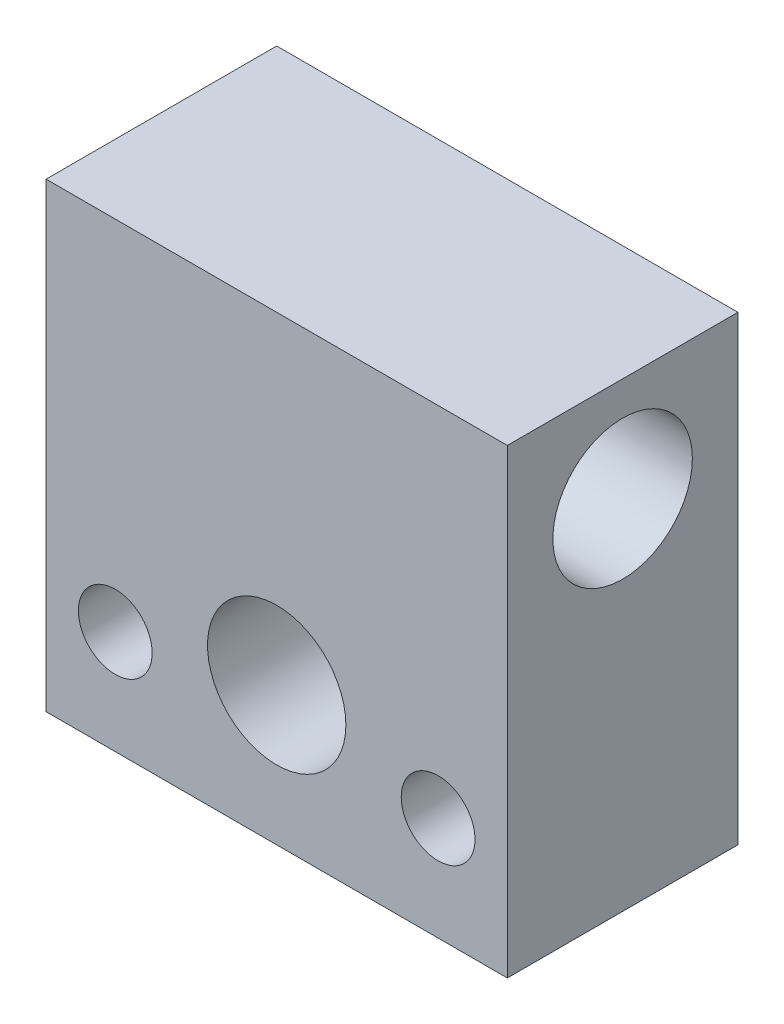
ISO-10303-21;
HEADER;
FILE_DESCRIPTION(('STEP AP214'),'2;1');
FILE_NAME('part.step','',(''),(''),'','','');
FILE_SCHEMA(('AUTOMOTIVE_DESIGN { 1 0 10303 214 1 1 1 1 }'));
ENDSEC;
DATA;
#1=APPLICATION_CONTEXT('core data for automotive mechanical design processes');
#2=APPLICATION_PROTOCOL_DEFINITION('international standard','automotive_design',2000,#1);
#3=PRODUCT_CONTEXT('',#1,'mechanical');
#4=PRODUCT('Part','Part','',(#3));
#5=PRODUCT_RELATED_PRODUCT_CATEGORY('part','',(#4));
#6=PRODUCT_DEFINITION_FORMATION('','',#4);
#7=PRODUCT_DEFINITION_CONTEXT('part definition',#1,'design');
#8=PRODUCT_DEFINITION('design','',#6,#7);
#9=PRODUCT_DEFINITION_SHAPE('','',#8);
#10=(LENGTH_UNIT() NAMED_UNIT(*) SI_UNIT(.MILLI.,.METRE.));
#11=(NAMED_UNIT(*) PLANE_ANGLE_UNIT() SI_UNIT($,.RADIAN.));
#12=(NAMED_UNIT(*) SI_UNIT($,.STERADIAN.) SOLID_ANGLE_UNIT());
#13=UNCERTAINTY_MEASURE_WITH_UNIT(LENGTH_MEASURE(1.E-05),#10,'distance_accuracy_value','');
#14=(GEOMETRIC_REPRESENTATION_CONTEXT(3) GLOBAL_UNCERTAINTY_ASSIGNED_CONTEXT((#13)) GLOBAL_UNIT_ASSIGNED_CONTEXT((#10,
#11,#12)) REPRESENTATION_CONTEXT('',''));
#15=CARTESIAN_POINT('',(0.,0.,0.));
#16=DIRECTION('',(0.,0.,1.));
#17=DIRECTION('',(1.,0.,0.));
#18=AXIS2_PLACEMENT_3D('',#15,#16,#17);
#19=CARTESIAN_POINT('',(10.,10.,10.));
#20=DIRECTION('',(1.,0.,0.));
#21=DIRECTION('',(0.,0.,-1.));
#22=AXIS2_PLACEMENT_3D('',#19,#20,#21);
#23=PLANE('',#22);
#24=CARTESIAN_POINT('',(10.,5.5,5.));
#25=DIRECTION('',(1.,0.,0.));
#26=DIRECTION('',(0.,0.,-1.));
#27=AXIS2_PLACEMENT_3D('',#24,#25,#26);
#28=CIRCLE('',#27,3.02500000000001);
#29=CARTESIAN_POINT('',(10.,5.5,1.97499999999999));
#30=VERTEX_POINT('',#29);
#31=EDGE_CURVE('E214',#30,#30,#28,.T.);
#32=ORIENTED_EDGE('',*,*,#31,.F.);
#33=EDGE_LOOP('',(#32));
#34=FACE_BOUND('',#33,.T.);
#35=DIRECTION('',(0.,-1.,0.));
#36=VECTOR('',#35,1.);
#37=CARTESIAN_POINT('',(10.,10.,0.));
#38=LINE('',#37,#36);
#39=CARTESIAN_POINT('',(10.,10.,0.));
#40=VERTEX_POINT('',#39);
#41=CARTESIAN_POINT('',(10.,-10.,0.));
#42=VERTEX_POINT('',#41);
#43=EDGE_CURVE('E108',#40,#42,#38,.T.);
#44=ORIENTED_EDGE('',*,*,#43,.F.);
#45=DIRECTION('',(0.,0.,-1.));
#46=VECTOR('',#45,1.);
#47=CARTESIAN_POINT('',(10.,10.,10.));
#48=LINE('',#47,#46);
#49=CARTESIAN_POINT('',(10.,10.,10.));
#50=VERTEX_POINT('',#49);
#51=EDGE_CURVE('E56',#50,#40,#48,.T.);
#52=ORIENTED_EDGE('',*,*,#51,.F.);
#53=DIRECTION('',(0.,-1.,0.));
#54=VECTOR('',#53,1.);
#55=CARTESIAN_POINT('',(10.,10.,10.));
#56=LINE('',#55,#54);
#57=CARTESIAN_POINT('',(10.,-10.,10.));
#58=VERTEX_POINT('',#57);
#59=EDGE_CURVE('E101',#50,#58,#56,.T.);
#60=ORIENTED_EDGE('',*,*,#59,.T.);
#61=DIRECTION('',(0.,0.,-1.));
#62=VECTOR('',#61,1.);
#63=CARTESIAN_POINT('',(10.,-10.,10.));
#64=LINE('',#63,#62);
#65=EDGE_CURVE('E84',#58,#42,#64,.T.);
#66=ORIENTED_EDGE('',*,*,#65,.T.);
#67=EDGE_LOOP('',(#44,#52,#60,#66));
#68=FACE_BOUND('',#67,.T.);
#69=ADVANCED_FACE('F38',(#34,#68),#23,.T.);
#70=CARTESIAN_POINT('',(-10.,10.,10.));
#71=DIRECTION('',(0.,1.,0.));
#72=DIRECTION('',(0.,0.,1.));
#73=AXIS2_PLACEMENT_3D('',#70,#71,#72);
#74=PLANE('',#73);
#75=DIRECTION('',(1.,0.,0.));
#76=VECTOR('',#75,1.);
#77=CARTESIAN_POINT('',(-10.,10.,0.));
#78=LINE('',#77,#76);
#79=CARTESIAN_POINT('',(-10.,10.,0.));
#80=VERTEX_POINT('',#79);
#81=EDGE_CURVE('E103',#80,#40,#78,.T.);
#82=ORIENTED_EDGE('',*,*,#81,.F.);
#83=DIRECTION('',(0.,0.,-1.));
#84=VECTOR('',#83,1.);
#85=CARTESIAN_POINT('',(-10.,10.,10.));
#86=LINE('',#85,#84);
#87=CARTESIAN_POINT('',(-10.,10.,10.));
#88=VERTEX_POINT('',#87);
#89=EDGE_CURVE('E73',#88,#80,#86,.T.);
#90=ORIENTED_EDGE('',*,*,#89,.F.);
#91=DIRECTION('',(1.,0.,0.));
#92=VECTOR('',#91,1.);
#93=CARTESIAN_POINT('',(-10.,10.,10.));
#94=LINE('',#93,#92);
#95=EDGE_CURVE('E98',#88,#50,#94,.T.);
#96=ORIENTED_EDGE('',*,*,#95,.T.);
#97=ORIENTED_EDGE('',*,*,#51,.T.);
#98=EDGE_LOOP('',(#82,#90,#96,#97));
#99=FACE_BOUND('',#98,.T.);
#100=ADVANCED_FACE('F176',(#99),#74,.T.);
#101=CARTESIAN_POINT('',(-10.,-10.,10.));
#102=DIRECTION('',(-1.,0.,0.));
#103=DIRECTION('',(0.,0.,1.));
#104=AXIS2_PLACEMENT_3D('',#101,#102,#103);
#105=PLANE('',#104);
#106=CARTESIAN_POINT('',(-10.,5.5,5.));
#107=DIRECTION('',(1.,0.,0.));
#108=DIRECTION('',(0.,0.,-1.));
#109=AXIS2_PLACEMENT_3D('',#106,#107,#108);
#110=CIRCLE('',#109,3.02500000000001);
#111=CARTESIAN_POINT('',(-10.,5.5,1.97499999999999));
#112=VERTEX_POINT('',#111);
#113=EDGE_CURVE('E197',#112,#112,#110,.T.);
#114=ORIENTED_EDGE('',*,*,#113,.T.);
#115=EDGE_LOOP('',(#114));
#116=FACE_BOUND('',#115,.T.);
#117=CARTESIAN_POINT('',(-10.,-1.5,2.));
#118=DIRECTION('',(-1.,0.,0.));
#119=DIRECTION('',(0.,0.,1.));
#120=AXIS2_PLACEMENT_3D('',#117,#118,#119);
#121=CIRCLE('',#120,0.999999999999989);
#122=CARTESIAN_POINT('',(-10.,-1.5,2.99999999999999));
#123=VERTEX_POINT('',#122);
#124=EDGE_CURVE('E201',#123,#123,#121,.T.);
#125=ORIENTED_EDGE('',*,*,#124,.F.);
#126=EDGE_LOOP('',(#125));
#127=FACE_BOUND('',#126,.T.);
#128=CARTESIAN_POINT('',(-10.,-1.5,5.5));
#129=DIRECTION('',(-1.,0.,0.));
#130=DIRECTION('',(0.,0.,1.));
#131=AXIS2_PLACEMENT_3D('',#128,#129,#130);
#132=CIRCLE('',#131,1.49999999999999);
#133=CARTESIAN_POINT('',(-10.,-1.5,6.99999999999999));
#134=VERTEX_POINT('',#133);
#135=EDGE_CURVE('E204',#134,#134,#132,.T.);
#136=ORIENTED_EDGE('',*,*,#135,.F.);
#137=EDGE_LOOP('',(#136));
#138=FACE_BOUND('',#137,.T.);
#139=DIRECTION('',(0.,1.,0.));
#140=VECTOR('',#139,1.);
#141=CARTESIAN_POINT('',(-10.,-10.,0.));
#142=LINE('',#141,#140);
#143=CARTESIAN_POINT('',(-10.,-10.,0.));
#144=VERTEX_POINT('',#143);
#145=EDGE_CURVE('E92',#144,#80,#142,.T.);
#146=ORIENTED_EDGE('',*,*,#145,.F.);
#147=DIRECTION('',(0.,0.,-1.));
#148=VECTOR('',#147,1.);
#149=CARTESIAN_POINT('',(-10.,-10.,10.));
#150=LINE('',#149,#148);
#151=CARTESIAN_POINT('',(-10.,-10.,10.));
#152=VERTEX_POINT('',#151);
#153=EDGE_CURVE('E87',#152,#144,#150,.T.);
#154=ORIENTED_EDGE('',*,*,#153,.F.);
#155=DIRECTION('',(0.,1.,0.));
#156=VECTOR('',#155,1.);
#157=CARTESIAN_POINT('',(-10.,-10.,10.));
#158=LINE('',#157,#156);
#159=EDGE_CURVE('E90',#152,#88,#158,.T.);
#160=ORIENTED_EDGE('',*,*,#159,.T.);
#161=ORIENTED_EDGE('',*,*,#89,.T.);
#162=EDGE_LOOP('',(#146,#154,#160,#161));
#163=FACE_BOUND('',#162,.T.);
#164=ADVANCED_FACE('F89',(#116,#127,#138,#163),#105,.T.);
#165=CARTESIAN_POINT('',(10.,-10.,10.));
#166=DIRECTION('',(0.,-1.,0.));
#167=DIRECTION('',(0.,0.,-1.));
#168=AXIS2_PLACEMENT_3D('',#165,#166,#167);
#169=PLANE('',#168);
#170=DIRECTION('',(-1.,0.,0.));
#171=VECTOR('',#170,1.);
#172=CARTESIAN_POINT('',(10.,-10.,0.));
#173=LINE('',#172,#171);
#174=EDGE_CURVE('E111',#42,#144,#173,.T.);
#175=ORIENTED_EDGE('',*,*,#174,.F.);
#176=ORIENTED_EDGE('',*,*,#65,.F.);
#177=DIRECTION('',(-1.,0.,0.));
#178=VECTOR('',#177,1.);
#179=CARTESIAN_POINT('',(10.,-10.,10.));
#180=LINE('',#179,#178);
#181=EDGE_CURVE('E97',#58,#152,#180,.T.);
#182=ORIENTED_EDGE('',*,*,#181,.T.);
#183=ORIENTED_EDGE('',*,*,#153,.T.);
#184=EDGE_LOOP('',(#175,#176,#182,#183));
#185=FACE_BOUND('',#184,.T.);
#186=ADVANCED_FACE('F100',(#185),#169,.T.);
#187=CARTESIAN_POINT('',(0.,0.,10.));
#188=DIRECTION('',(0.,0.,-1.));
#189=DIRECTION('',(-1.,0.,0.));
#190=AXIS2_PLACEMENT_3D('',#187,#188,#189);
#191=PLANE('',#190);
#192=CARTESIAN_POINT('',(-7.,-5.5,10.));
#193=DIRECTION('',(0.,0.,-1.));
#194=DIRECTION('',(-1.,0.,0.));
#195=AXIS2_PLACEMENT_3D('',#192,#193,#194);
#196=CIRCLE('',#195,1.59999999999999);
#197=CARTESIAN_POINT('',(-8.59999999999999,-5.5,10.));
#198=VERTEX_POINT('',#197);
#199=EDGE_CURVE('E148',#198,#198,#196,.T.);
#200=ORIENTED_EDGE('',*,*,#199,.T.);
#201=EDGE_LOOP('',(#200));
#202=FACE_BOUND('',#201,.T.);
#203=CARTESIAN_POINT('',(7.,-5.5,10.));
#204=DIRECTION('',(0.,0.,-1.));
#205=DIRECTION('',(-1.,0.,0.));
#206=AXIS2_PLACEMENT_3D('',#203,#204,#205);
#207=CIRCLE('',#206,1.59999999999999);
#208=CARTESIAN_POINT('',(5.40000000000001,-5.5,10.));
#209=VERTEX_POINT('',#208);
#210=EDGE_CURVE('E145',#209,#209,#207,.T.);
#211=ORIENTED_EDGE('',*,*,#210,.T.);
#212=EDGE_LOOP('',(#211));
#213=FACE_BOUND('',#212,.T.);
#214=CARTESIAN_POINT('',(0.,-4.,10.));
#215=DIRECTION('',(0.,0.,1.));
#216=DIRECTION('',(1.,0.,0.));
#217=AXIS2_PLACEMENT_3D('',#214,#215,#216);
#218=CIRCLE('',#217,2.99999999999999);
#219=CARTESIAN_POINT('',(2.99999999999999,-4.,10.));
#220=VERTEX_POINT('',#219);
#221=EDGE_CURVE('E147',#220,#220,#218,.T.);
#222=ORIENTED_EDGE('',*,*,#221,.F.);
#223=EDGE_LOOP('',(#222));
#224=FACE_BOUND('',#223,.T.);
#225=ORIENTED_EDGE('',*,*,#59,.F.);
#226=ORIENTED_EDGE('',*,*,#95,.F.);
#227=ORIENTED_EDGE('',*,*,#159,.F.);
#228=ORIENTED_EDGE('',*,*,#181,.F.);
#229=EDGE_LOOP('',(#225,#226,#227,#228));
#230=FACE_BOUND('',#229,.T.);
#231=ADVANCED_FACE('F96',(#202,#213,#224,#230),#191,.F.);
#232=CARTESIAN_POINT('',(0.,0.,0.));
#233=DIRECTION('',(0.,0.,-1.));
#234=DIRECTION('',(-1.,0.,0.));
#235=AXIS2_PLACEMENT_3D('',#232,#233,#234);
#236=PLANE('',#235);
#237=CARTESIAN_POINT('',(7.,-5.5,0.));
#238=DIRECTION('',(0.,0.,-1.));
#239=DIRECTION('',(-1.,0.,0.));
#240=AXIS2_PLACEMENT_3D('',#237,#238,#239);
#241=CIRCLE('',#240,2.80000000002082);
#242=CARTESIAN_POINT('',(4.19999999997918,-5.5,0.));
#243=VERTEX_POINT('',#242);
#244=EDGE_CURVE('E48',#243,#243,#241,.F.);
#245=ORIENTED_EDGE('',*,*,#244,.T.);
#246=EDGE_LOOP('',(#245));
#247=FACE_BOUND('',#246,.T.);
#248=CARTESIAN_POINT('',(-7.,-5.5,0.));
#249=DIRECTION('',(0.,0.,-1.));
#250=DIRECTION('',(-1.,0.,0.));
#251=AXIS2_PLACEMENT_3D('',#248,#249,#250);
#252=CIRCLE('',#251,2.80000000002082);
#253=CARTESIAN_POINT('',(-9.80000000002082,-5.5,0.));
#254=VERTEX_POINT('',#253);
#255=EDGE_CURVE('E123',#254,#254,#252,.F.);
#256=ORIENTED_EDGE('',*,*,#255,.T.);
#257=EDGE_LOOP('',(#256));
#258=FACE_BOUND('',#257,.T.);
#259=CARTESIAN_POINT('',(0.,5.5,0.));
#260=DIRECTION('',(0.,0.,-1.));
#261=DIRECTION('',(-1.,0.,0.));
#262=AXIS2_PLACEMENT_3D('',#259,#260,#261);
#263=CIRCLE('',#262,1.49999999999999);
#264=CARTESIAN_POINT('',(-1.49999999999999,5.5,0.));
#265=VERTEX_POINT('',#264);
#266=EDGE_CURVE('E225',#265,#265,#263,.T.);
#267=ORIENTED_EDGE('',*,*,#266,.F.);
#268=EDGE_LOOP('',(#267));
#269=FACE_BOUND('',#268,.T.);
#270=CARTESIAN_POINT('',(0.,-4.,0.));
#271=DIRECTION('',(0.,0.,1.));
#272=DIRECTION('',(1.,0.,0.));
#273=AXIS2_PLACEMENT_3D('',#270,#271,#272);
#274=CIRCLE('',#273,2.99999999999999);
#275=CARTESIAN_POINT('',(2.99999999999999,-4.,0.));
#276=VERTEX_POINT('',#275);
#277=EDGE_CURVE('E112',#276,#276,#274,.T.);
#278=ORIENTED_EDGE('',*,*,#277,.T.);
#279=EDGE_LOOP('',(#278));
#280=FACE_BOUND('',#279,.T.);
#281=ORIENTED_EDGE('',*,*,#43,.T.);
#282=ORIENTED_EDGE('',*,*,#174,.T.);
#283=ORIENTED_EDGE('',*,*,#145,.T.);
#284=ORIENTED_EDGE('',*,*,#81,.T.);
#285=EDGE_LOOP('',(#281,#282,#283,#284));
#286=FACE_BOUND('',#285,.T.);
#287=ADVANCED_FACE('F128',(#247,#258,#269,#280,#286),#236,.T.);
#288=CARTESIAN_POINT('',(0.,-4.,10.));
#289=DIRECTION('',(0.,0.,1.));
#290=DIRECTION('',(1.,0.,0.));
#291=AXIS2_PLACEMENT_3D('',#288,#289,#290);
#292=CYLINDRICAL_SURFACE('',#291,2.99999999999999);
#293=ORIENTED_EDGE('',*,*,#277,.F.);
#294=EDGE_LOOP('',(#293));
#295=FACE_BOUND('',#294,.T.);
#296=ORIENTED_EDGE('',*,*,#221,.T.);
#297=EDGE_LOOP('',(#296));
#298=FACE_BOUND('',#297,.T.);
#299=ADVANCED_FACE('F141',(#295,#298),#292,.F.);
#300=CARTESIAN_POINT('',(7.,-5.5,0.));
#301=DIRECTION('',(0.,0.,-1.));
#302=DIRECTION('',(-1.,0.,0.));
#303=AXIS2_PLACEMENT_3D('',#300,#301,#302);
#304=CYLINDRICAL_SURFACE('',#303,1.59999999999999);
#305=CARTESIAN_POINT('',(7.,-5.5,1.20000000002082));
#306=DIRECTION('',(0.,0.,-1.));
#307=DIRECTION('',(-1.,0.,0.));
#308=AXIS2_PLACEMENT_3D('',#305,#306,#307);
#309=CIRCLE('',#308,1.59999999999999);
#310=CARTESIAN_POINT('',(5.40000000000001,-5.5,1.20000000002082));
#311=VERTEX_POINT('',#310);
#312=EDGE_CURVE('E118',#311,#311,#309,.T.);
#313=ORIENTED_EDGE('',*,*,#312,.T.);
#314=EDGE_LOOP('',(#313));
#315=FACE_BOUND('',#314,.T.);
#316=ORIENTED_EDGE('',*,*,#210,.F.);
#317=EDGE_LOOP('',(#316));
#318=FACE_BOUND('',#317,.T.);
#319=ADVANCED_FACE('F137',(#315,#318),#304,.F.);
#320=CARTESIAN_POINT('',(-7.,-5.5,0.));
#321=DIRECTION('',(0.,0.,-1.));
#322=DIRECTION('',(-1.,0.,0.));
#323=AXIS2_PLACEMENT_3D('',#320,#321,#322);
#324=CYLINDRICAL_SURFACE('',#323,1.59999999999999);
#325=CARTESIAN_POINT('',(-7.,-5.5,1.20000000002082));
#326=DIRECTION('',(0.,0.,-1.));
#327=DIRECTION('',(-1.,0.,0.));
#328=AXIS2_PLACEMENT_3D('',#325,#326,#327);
#329=CIRCLE('',#328,1.59999999999999);
#330=CARTESIAN_POINT('',(-8.59999999999999,-5.5,1.20000000002082));
#331=VERTEX_POINT('',#330);
#332=EDGE_CURVE('E11',#331,#331,#329,.T.);
#333=ORIENTED_EDGE('',*,*,#332,.T.);
#334=EDGE_LOOP('',(#333));
#335=FACE_BOUND('',#334,.T.);
#336=ORIENTED_EDGE('',*,*,#199,.F.);
#337=EDGE_LOOP('',(#336));
#338=FACE_BOUND('',#337,.T.);
#339=ADVANCED_FACE('F140',(#335,#338),#324,.F.);
#340=CARTESIAN_POINT('',(-6.,-1.5,5.5));
#341=DIRECTION('',(1.,0.,0.));
#342=DIRECTION('',(0.,0.,-1.));
#343=AXIS2_PLACEMENT_3D('',#340,#341,#342);
#344=PLANE('',#343);
#345=CARTESIAN_POINT('',(-6.,-1.5,5.5));
#346=DIRECTION('',(-1.,0.,0.));
#347=DIRECTION('',(0.,0.,1.));
#348=AXIS2_PLACEMENT_3D('',#345,#346,#347);
#349=CIRCLE('',#348,1.49999999999999);
#350=CARTESIAN_POINT('',(-6.,-1.5,6.99999999999999));
#351=VERTEX_POINT('',#350);
#352=EDGE_CURVE('E153',#351,#351,#349,.T.);
#353=ORIENTED_EDGE('',*,*,#352,.T.);
#354=EDGE_LOOP('',(#353));
#355=FACE_BOUND('',#354,.T.);
#356=ADVANCED_FACE('F257',(#355),#344,.F.);
#357=CARTESIAN_POINT('',(-10.,-1.5,5.5));
#358=DIRECTION('',(-1.,0.,0.));
#359=DIRECTION('',(0.,0.,1.));
#360=AXIS2_PLACEMENT_3D('',#357,#358,#359);
#361=CYLINDRICAL_SURFACE('',#360,1.49999999999999);
#362=ORIENTED_EDGE('',*,*,#352,.F.);
#363=EDGE_LOOP('',(#362));
#364=FACE_BOUND('',#363,.T.);
#365=ORIENTED_EDGE('',*,*,#135,.T.);
#366=EDGE_LOOP('',(#365));
#367=FACE_BOUND('',#366,.T.);
#368=ADVANCED_FACE('F253',(#364,#367),#361,.F.);
#369=CARTESIAN_POINT('',(-5.,-1.5,2.));
#370=DIRECTION('',(1.,0.,0.));
#371=DIRECTION('',(0.,0.,-1.));
#372=AXIS2_PLACEMENT_3D('',#369,#370,#371);
#373=PLANE('',#372);
#374=CARTESIAN_POINT('',(-5.,-1.5,2.));
#375=DIRECTION('',(-1.,0.,0.));
#376=DIRECTION('',(0.,0.,1.));
#377=AXIS2_PLACEMENT_3D('',#374,#375,#376);
#378=CIRCLE('',#377,0.999999999999987);
#379=CARTESIAN_POINT('',(-5.,-1.5,2.99999999999999));
#380=VERTEX_POINT('',#379);
#381=EDGE_CURVE('E206',#380,#380,#378,.T.);
#382=ORIENTED_EDGE('',*,*,#381,.T.);
#383=EDGE_LOOP('',(#382));
#384=FACE_BOUND('',#383,.T.);
#385=ADVANCED_FACE('F247',(#384),#373,.F.);
#386=CARTESIAN_POINT('',(-10.,-1.5,2.));
#387=DIRECTION('',(-1.,0.,0.));
#388=DIRECTION('',(0.,0.,1.));
#389=AXIS2_PLACEMENT_3D('',#386,#387,#388);
#390=CYLINDRICAL_SURFACE('',#389,0.999999999999988);
#391=ORIENTED_EDGE('',*,*,#381,.F.);
#392=EDGE_LOOP('',(#391));
#393=FACE_BOUND('',#392,.T.);
#394=ORIENTED_EDGE('',*,*,#124,.T.);
#395=EDGE_LOOP('',(#394));
#396=FACE_BOUND('',#395,.T.);
#397=ADVANCED_FACE('F235',(#393,#396),#390,.F.);
#398=CARTESIAN_POINT('',(10.,5.5,5.));
#399=DIRECTION('',(1.,0.,0.));
#400=DIRECTION('',(0.,0.,-1.));
#401=AXIS2_PLACEMENT_3D('',#398,#399,#400);
#402=CYLINDRICAL_SURFACE('',#401,3.02500000000001);
#403=CARTESIAN_POINT('',(-1.49999999999999,5.5,1.97499999999999));
#404=CARTESIAN_POINT('',(-1.49999509962479,5.57893590093414,1.97500423690761));
#405=CARTESIAN_POINT('',(-1.49373249258344,5.65796823300331,1.97812294777516));
#406=CARTESIAN_POINT('',(-1.4689567052255,5.81370198588523,1.99029124883477));
#407=CARTESIAN_POINT('',(-1.450419754428,5.89039858125646,1.99935234672035));
#408=CARTESIAN_POINT('',(-1.40199593569061,6.03896938931931,2.02245601615646));
#409=CARTESIAN_POINT('',(-1.37215293182335,6.11086099162089,2.03647932213715));
#410=CARTESIAN_POINT('',(-1.30218873100704,6.24851263962994,2.06821718018733));
#411=CARTESIAN_POINT('',(-1.26206845548203,6.31427323430144,2.08593140131579));
#412=CARTESIAN_POINT('',(-1.16995825581147,6.44221959873118,2.12466033745708));
#413=CARTESIAN_POINT('',(-1.11740207602653,6.50395655702864,2.14580906226332));
#414=CARTESIAN_POINT('',(-1.00312960780386,6.61815215536927,2.18857935345825));
#415=CARTESIAN_POINT('',(-0.941406525380285,6.67060384996064,2.21020126032116));
#416=CARTESIAN_POINT('',(-0.804926502591932,6.76873177874462,2.25335969892203));
#417=CARTESIAN_POINT('',(-0.729535688232136,6.81359087008269,2.2747650261802));
#418=CARTESIAN_POINT('',(-0.571103121094629,6.88980305359036,2.31282688885999));
#419=CARTESIAN_POINT('',(-0.488066817268337,6.92116567563774,2.32948677222731));
#420=CARTESIAN_POINT('',(-0.321740649879955,6.96747422405764,2.35466325369976));
#421=CARTESIAN_POINT('',(-0.238759143349821,6.98328503674737,2.36360497187166));
#422=CARTESIAN_POINT('',(-0.0708792557123923,7.00069286050274,2.37347037676925));
#423=CARTESIAN_POINT('',(0.0140172082769357,7.00230350527039,2.3744017542701));
#424=CARTESIAN_POINT('',(0.172629390508849,6.9919004656488,2.3684843021553));
#425=CARTESIAN_POINT('',(0.246489953507919,6.98146053878196,2.36253401133857));
#426=CARTESIAN_POINT('',(0.391230862555358,6.94997463227055,2.34509526751153));
#427=CARTESIAN_POINT('',(0.46211027772474,6.92892536605507,2.33360509840055));
#428=CARTESIAN_POINT('',(0.600897612613599,6.8764297571782,2.3061259924178));
#429=CARTESIAN_POINT('',(0.668697716990569,6.84475244037372,2.29003840914697));
#430=CARTESIAN_POINT('',(0.798343176864186,6.77207598745002,2.25517387932311));
#431=CARTESIAN_POINT('',(0.860185843560672,6.73107266998107,2.23639572784476));
#432=CARTESIAN_POINT('',(0.98426287702167,6.63495629159351,2.19544091395373));
#433=CARTESIAN_POINT('',(1.04558837277975,6.57872237356325,2.17313212309627));
#434=CARTESIAN_POINT('',(1.15831324549263,6.4566689055841,2.12952794106701));
#435=CARTESIAN_POINT('',(1.20970802720405,6.39084494262209,2.10823302246295));
#436=CARTESIAN_POINT('',(1.30327958057543,6.24772359490992,2.06788484644499));
#437=CARTESIAN_POINT('',(1.34493778325854,6.17004332638308,2.04897549110801));
#438=CARTESIAN_POINT('',(1.41425639006492,6.00760158510401,2.01674675198416));
#439=CARTESIAN_POINT('',(1.44192773639363,5.92284570842114,2.00342299986172));
#440=CARTESIAN_POINT('',(1.48024291010271,5.756103303868,1.98479033724439));
#441=CARTESIAN_POINT('',(1.49209575443924,5.67445853952101,1.97891434825992));
#442=CARTESIAN_POINT('',(1.50221946975549,5.51013925497667,1.97390253354601));
#443=CARTESIAN_POINT('',(1.50049661794848,5.42746522834984,1.97476359269782));
#444=CARTESIAN_POINT('',(1.48422709154185,5.2701078611804,1.98279696262773));
#445=CARTESIAN_POINT('',(1.4706643363184,5.19529452925663,1.9894849610347));
#446=CARTESIAN_POINT('',(1.43263378812217,5.0491526922284,2.00787895139088));
#447=CARTESIAN_POINT('',(1.40816478395946,4.97782457514985,2.01958550066812));
#448=CARTESIAN_POINT('',(1.34835947613133,4.83829246238969,2.0473777137644));
#449=CARTESIAN_POINT('',(1.3127292500073,4.77023855344706,2.06358027181813));
#450=CARTESIAN_POINT('',(1.2319423985349,4.64084791639176,2.0987957423521));
#451=CARTESIAN_POINT('',(1.18678168706662,4.57951408665005,2.11780985921585));
#452=CARTESIAN_POINT('',(1.08315935945838,4.45900137855612,2.15898187089909));
#453=CARTESIAN_POINT('',(1.02383268113162,4.40060797566909,2.18126583332401));
#454=CARTESIAN_POINT('',(0.896156085518513,4.29425794092325,2.22508983758684));
#455=CARTESIAN_POINT('',(0.827800228080099,4.24630823529593,2.24662937780888));
#456=CARTESIAN_POINT('',(0.679994673096092,4.16012876601257,2.28748221902992));
#457=CARTESIAN_POINT('',(0.600177961028196,4.12245153823489,2.30664635652344));
#458=CARTESIAN_POINT('',(0.434079023404671,4.06146740033352,2.33871197411859));
#459=CARTESIAN_POINT('',(0.34780514939269,4.03814227583367,2.35162138769955));
#460=CARTESIAN_POINT('',(0.18005681422314,4.00865024547697,2.36812597066262));
#461=CARTESIAN_POINT('',(0.0989102907785373,4.00105806753854,2.3724925861285));
#462=CARTESIAN_POINT('',(-0.0635759172879718,3.99915002498371,2.37358045316075));
#463=CARTESIAN_POINT('',(-0.144915508979837,4.00482871359193,2.37030484133524));
#464=CARTESIAN_POINT('',(-0.297572863499003,4.02797438537511,2.35729087021933));
#465=CARTESIAN_POINT('',(-0.369122800132186,4.04430522520092,2.34817676619046));
#466=CARTESIAN_POINT('',(-0.508394724895596,4.08690356677391,2.32523548901739));
#467=CARTESIAN_POINT('',(-0.576115489108395,4.11317422517618,2.31140681877485));
#468=CARTESIAN_POINT('',(-0.710842552877358,4.17688798166128,2.27945814644924));
#469=CARTESIAN_POINT('',(-0.777494575826533,4.21496358254217,2.26111210385297));
#470=CARTESIAN_POINT('',(-0.903896366832481,4.30049933709244,2.22258700738548));
#471=CARTESIAN_POINT('',(-0.963642552866443,4.3479643266899,2.20240701185926));
#472=CARTESIAN_POINT('',(-1.08191286316876,4.45754617244871,2.15961833965351));
#473=CARTESIAN_POINT('',(-1.13944903594626,4.52073367673915,2.13700587519784));
#474=CARTESIAN_POINT('',(-1.24331496860024,4.65651134908542,2.09410651010437));
#475=CARTESIAN_POINT('',(-1.28963880310961,4.72910645778572,2.07382084207118));
#476=CARTESIAN_POINT('',(-1.3697383515626,4.88247236883852,2.03764905265887));
#477=CARTESIAN_POINT('',(-1.40344642634527,4.96328436823415,2.02178675955999));
#478=CARTESIAN_POINT('',(-1.45635993302528,5.13034495444836,1.99649170901624));
#479=CARTESIAN_POINT('',(-1.47560684791264,5.21657721568425,1.98704056830642));
#480=CARTESIAN_POINT('',(-1.49141303937071,5.33639494596053,1.97925013840564));
#481=CARTESIAN_POINT('',(-1.49462874303556,5.36900662672013,1.97766035996978));
#482=CARTESIAN_POINT('',(-1.49892327091625,5.43440665006077,1.9755343959156));
#483=CARTESIAN_POINT('',(-1.50000203654888,5.46719499746034,1.97499823918186));
#484=CARTESIAN_POINT('',(-1.49999999999999,5.5,1.97499999999999));
#485=B_SPLINE_CURVE_WITH_KNOTS('',3,(#403,#404,#405,#406,#407,#408,#409,#410,#411,#412,#413,
#414,#415,#416,#417,#418,#419,#420,#421,#422,#423,#424,#425,#426,#427,#428,#429,#430,#431,#432,
#433,#434,#435,#436,#437,#438,#439,#440,#441,#442,#443,#444,#445,#446,#447,#448,#449,#450,#451,
#452,#453,#454,#455,#456,#457,#458,#459,#460,#461,#462,#463,#464,#465,#466,#467,#468,#469,#470,
#471,#472,#473,#474,#475,#476,#477,#478,#479,#480,#481,#482,#483,#484),.UNSPECIFIED.,.T.,.F.,(4,
2,2,2,2,2,2,2,2,2,2,2,2,2,2,2,2,2,2,2,2,2,2,2,2,2,2,2,2,2,2,2,2,2,2,2,2,2,2,2,4),(0.,
0.236674479478507,0.47380864828131,0.71003207635647,0.946234332877658,1.19655889114782,
1.44706991020208,1.71660697184687,1.98595339942491,2.23929230307252,2.49238794736489,
2.71583779216306,2.93935690004275,3.16808755675977,3.39692096864948,3.65422981647765,
3.91165744528798,4.18066344241983,4.4494586636396,4.69623801263575,4.94290326098782,
5.17083405879893,5.39879017569976,5.63334132094328,5.86799323317674,6.12539561225545,
6.38296818357791,6.6524611487934,6.92161138893838,7.16507063741538,7.40842998021327,
7.62933284148611,7.85030591533079,8.08613847162422,8.32209280929074,8.58607157865746,
8.85018954936916,9.11570396013874,9.38045378280393,9.47881072771317,9.57717036899783),.UNSPECIFIED.);
#486=CARTESIAN_POINT('',(-1.49999999999999,5.5,1.97499999999999));
#487=VERTEX_POINT('',#486);
#488=EDGE_CURVE('E217',#487,#487,#485,.T.);
#489=ORIENTED_EDGE('',*,*,#488,.T.);
#490=EDGE_LOOP('',(#489));
#491=FACE_BOUND('',#490,.T.);
#492=ORIENTED_EDGE('',*,*,#113,.F.);
#493=EDGE_LOOP('',(#492));
#494=FACE_BOUND('',#493,.T.);
#495=ORIENTED_EDGE('',*,*,#31,.T.);
#496=EDGE_LOOP('',(#495));
#497=FACE_BOUND('',#496,.T.);
#498=ADVANCED_FACE('F230',(#491,#494,#497),#402,.F.);
#499=CARTESIAN_POINT('',(0.,5.5,0.));
#500=DIRECTION('',(0.,0.,-1.));
#501=DIRECTION('',(-1.,0.,0.));
#502=AXIS2_PLACEMENT_3D('',#499,#500,#501);
#503=CYLINDRICAL_SURFACE('',#502,1.49999999999999);
#504=ORIENTED_EDGE('',*,*,#488,.F.);
#505=EDGE_LOOP('',(#504));
#506=FACE_BOUND('',#505,.T.);
#507=ORIENTED_EDGE('',*,*,#266,.T.);
#508=EDGE_LOOP('',(#507));
#509=FACE_BOUND('',#508,.T.);
#510=ADVANCED_FACE('F134',(#506,#509),#503,.F.);
#511=CARTESIAN_POINT('',(7.,-5.5,1.20000000002082));
#512=DIRECTION('',(0.,0.,-1.));
#513=DIRECTION('',(-1.,0.,0.));
#514=AXIS2_PLACEMENT_3D('',#511,#512,#513);
#515=CONICAL_SURFACE('',#514,1.59999999999999,0.785398163397452);
#516=ORIENTED_EDGE('',*,*,#244,.F.);
#517=EDGE_LOOP('',(#516));
#518=FACE_BOUND('',#517,.T.);
#519=ORIENTED_EDGE('',*,*,#312,.F.);
#520=EDGE_LOOP('',(#519));
#521=FACE_BOUND('',#520,.T.);
#522=ADVANCED_FACE('F131',(#518,#521),#515,.F.);
#523=CARTESIAN_POINT('',(-7.,-5.5,1.20000000002082));
#524=DIRECTION('',(0.,0.,-1.));
#525=DIRECTION('',(-1.,0.,0.));
#526=AXIS2_PLACEMENT_3D('',#523,#524,#525);
#527=CONICAL_SURFACE('',#526,1.59999999999999,0.785398163397452);
#528=ORIENTED_EDGE('',*,*,#255,.F.);
#529=EDGE_LOOP('',(#528));
#530=FACE_BOUND('',#529,.T.);
#531=ORIENTED_EDGE('',*,*,#332,.F.);
#532=EDGE_LOOP('',(#531));
#533=FACE_BOUND('',#532,.T.);
#534=ADVANCED_FACE('F41',(#530,#533),#527,.F.);
#535=CLOSED_SHELL('',(#69,#100,#164,#186,#231,#287,#299,#319,#339,#356,#368,#385,#397,#498,#510,
#522,#534));
#536=MANIFOLD_SOLID_BREP('B2',#535);
#537=ADVANCED_BREP_SHAPE_REPRESENTATION('',(#18,#536),#14);
#538=SHAPE_DEFINITION_REPRESENTATION(#9,#537);
ENDSEC;
END-ISO-10303-21;
